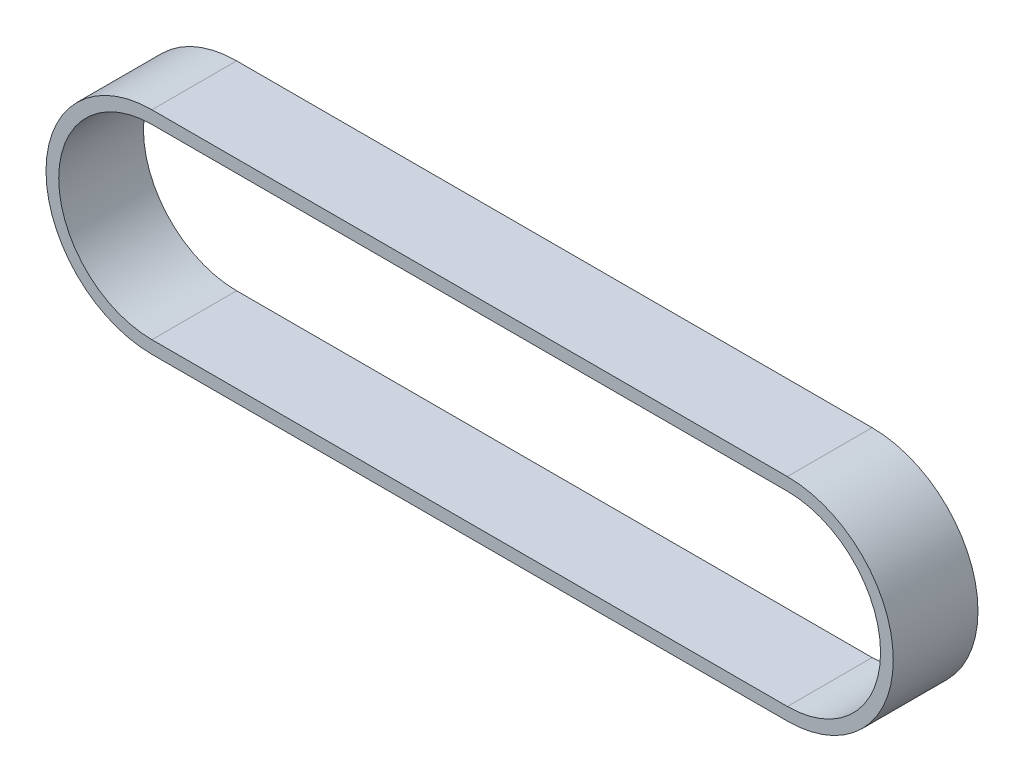
ISO-10303-21;
HEADER;
FILE_DESCRIPTION(('STEP AP214'),'2;1');
FILE_NAME('part.step','',(''),(''),'','','');
FILE_SCHEMA(('AUTOMOTIVE_DESIGN { 1 0 10303 214 1 1 1 1 }'));
ENDSEC;
DATA;
#1=APPLICATION_CONTEXT('core data for automotive mechanical design processes');
#2=APPLICATION_PROTOCOL_DEFINITION('international standard','automotive_design',2000,#1);
#3=PRODUCT_CONTEXT('',#1,'mechanical');
#4=PRODUCT('Part','Part','',(#3));
#5=PRODUCT_RELATED_PRODUCT_CATEGORY('part','',(#4));
#6=PRODUCT_DEFINITION_FORMATION('','',#4);
#7=PRODUCT_DEFINITION_CONTEXT('part definition',#1,'design');
#8=PRODUCT_DEFINITION('design','',#6,#7);
#9=PRODUCT_DEFINITION_SHAPE('','',#8);
#10=(LENGTH_UNIT() NAMED_UNIT(*) SI_UNIT(.MILLI.,.METRE.));
#11=(NAMED_UNIT(*) PLANE_ANGLE_UNIT() SI_UNIT($,.RADIAN.));
#12=(NAMED_UNIT(*) SI_UNIT($,.STERADIAN.) SOLID_ANGLE_UNIT());
#13=UNCERTAINTY_MEASURE_WITH_UNIT(LENGTH_MEASURE(1.E-05),#10,'distance_accuracy_value','');
#14=(GEOMETRIC_REPRESENTATION_CONTEXT(3) GLOBAL_UNCERTAINTY_ASSIGNED_CONTEXT((#13)) GLOBAL_UNIT_ASSIGNED_CONTEXT((#10,
#11,#12)) REPRESENTATION_CONTEXT('',''));
#15=CARTESIAN_POINT('',(0.,0.,0.));
#16=DIRECTION('',(0.,0.,1.));
#17=DIRECTION('',(1.,0.,0.));
#18=AXIS2_PLACEMENT_3D('',#15,#16,#17);
#19=CARTESIAN_POINT('',(5.24580379135386E-12,-9.09688990802238E-12,20.));
#20=DIRECTION('',(0.,0.,-1.));
#21=DIRECTION('',(-1.,0.,0.));
#22=AXIS2_PLACEMENT_3D('',#19,#20,#21);
#23=PLANE('',#22);
#24=CARTESIAN_POINT('',(5.24580379135386E-12,-9.09688990802238E-12,20.));
#25=DIRECTION('',(0.,0.,-1.));
#26=DIRECTION('',(-1.,0.,0.));
#27=AXIS2_PLACEMENT_3D('',#24,#25,#26);
#28=CIRCLE('',#27,50.);
#29=CARTESIAN_POINT('',(-0.0070480078109051,49.9999995032468,20.));
#30=VERTEX_POINT('',#29);
#31=CARTESIAN_POINT('',(0.00704800782141968,-49.999999503265,20.));
#32=VERTEX_POINT('',#31);
#33=EDGE_CURVE('E160',#30,#32,#28,.F.);
#34=ORIENTED_EDGE('',*,*,#33,.T.);
#35=DIRECTION('',(0.999999990065117,0.000140960156323018,0.));
#36=VECTOR('',#35,1.);
#37=CARTESIAN_POINT('',(0.00704800782139671,-49.999999503265,20.));
#38=LINE('',#37,#36);
#39=CARTESIAN_POINT('',(300.00704502735,-49.9577114563681,20.));
#40=VERTEX_POINT('',#39);
#41=EDGE_CURVE('E163',#32,#40,#38,.T.);
#42=ORIENTED_EDGE('',*,*,#41,.T.);
#43=CARTESIAN_POINT('',(299.999997019533,0.0422880468878076,20.));
#44=DIRECTION('',(0.,0.,-1.));
#45=DIRECTION('',(-1.,0.,0.));
#46=AXIS2_PLACEMENT_3D('',#43,#44,#45);
#47=CIRCLE('',#46,50.);
#48=CARTESIAN_POINT('',(299.992949011717,50.0422875501437,20.));
#49=VERTEX_POINT('',#48);
#50=EDGE_CURVE('E166',#40,#49,#47,.F.);
#51=ORIENTED_EDGE('',*,*,#50,.T.);
#52=DIRECTION('',(-0.999999990065117,-0.000140960156323018,0.));
#53=VECTOR('',#52,1.);
#54=CARTESIAN_POINT('',(-0.0070480078109051,49.9999995032468,20.));
#55=LINE('',#54,#53);
#56=EDGE_CURVE('E168',#49,#30,#55,.T.);
#57=ORIENTED_EDGE('',*,*,#56,.T.);
#58=EDGE_LOOP('',(#34,#42,#51,#57));
#59=FACE_BOUND('',#58,.T.);
#60=CARTESIAN_POINT('',(5.24580379135386E-12,-9.09688990802238E-12,20.));
#61=DIRECTION('',(0.,0.,1.));
#62=DIRECTION('',(-1.,0.,0.));
#63=AXIS2_PLACEMENT_3D('',#60,#61,#62);
#64=CIRCLE('',#63,44.);
#65=CARTESIAN_POINT('',(-0.006202246872967,43.9999995628561,20.));
#66=VERTEX_POINT('',#65);
#67=CARTESIAN_POINT('',(0.0062022468834586,-43.9999995628743,20.));
#68=VERTEX_POINT('',#67);
#69=EDGE_CURVE('E124',#66,#68,#64,.T.);
#70=ORIENTED_EDGE('',*,*,#69,.F.);
#71=DIRECTION('',(-0.999999990065117,-0.000140960156323018,0.));
#72=VECTOR('',#71,1.);
#73=CARTESIAN_POINT('',(-0.006202246872967,43.9999995628561,20.));
#74=LINE('',#73,#72);
#75=CARTESIAN_POINT('',(299.993794772655,44.042287609753,20.));
#76=VERTEX_POINT('',#75);
#77=EDGE_CURVE('E146',#76,#66,#74,.T.);
#78=ORIENTED_EDGE('',*,*,#77,.F.);
#79=CARTESIAN_POINT('',(299.999997019533,0.0422880468878076,20.));
#80=DIRECTION('',(0.,0.,1.));
#81=DIRECTION('',(-1.,0.,0.));
#82=AXIS2_PLACEMENT_3D('',#79,#80,#81);
#83=CIRCLE('',#82,44.);
#84=CARTESIAN_POINT('',(300.006199266412,-43.9577115159774,20.));
#85=VERTEX_POINT('',#84);
#86=EDGE_CURVE('E144',#85,#76,#83,.T.);
#87=ORIENTED_EDGE('',*,*,#86,.F.);
#88=DIRECTION('',(0.999999990065117,0.000140960156323018,0.));
#89=VECTOR('',#88,1.);
#90=CARTESIAN_POINT('',(300.006199266412,-43.9577115159774,20.));
#91=LINE('',#90,#89);
#92=EDGE_CURVE('E132',#68,#85,#91,.T.);
#93=ORIENTED_EDGE('',*,*,#92,.F.);
#94=EDGE_LOOP('',(#70,#78,#87,#93));
#95=FACE_BOUND('',#94,.T.);
#96=ADVANCED_FACE('F59',(#59,#95),#23,.F.);
#97=CARTESIAN_POINT('',(5.24580379135386E-12,-9.09688990802238E-12,-20.));
#98=DIRECTION('',(0.,0.,-1.));
#99=DIRECTION('',(-1.,0.,0.));
#100=AXIS2_PLACEMENT_3D('',#97,#98,#99);
#101=PLANE('',#100);
#102=CARTESIAN_POINT('',(5.24580379135386E-12,-9.09688990802238E-12,-20.));
#103=DIRECTION('',(0.,0.,-1.));
#104=DIRECTION('',(-1.,0.,0.));
#105=AXIS2_PLACEMENT_3D('',#102,#103,#104);
#106=CIRCLE('',#105,50.);
#107=CARTESIAN_POINT('',(-0.0070480078109051,49.9999995032468,-20.));
#108=VERTEX_POINT('',#107);
#109=CARTESIAN_POINT('',(0.00704800782141968,-49.999999503265,-20.));
#110=VERTEX_POINT('',#109);
#111=EDGE_CURVE('E140',#108,#110,#106,.F.);
#112=ORIENTED_EDGE('',*,*,#111,.F.);
#113=DIRECTION('',(-0.999999990065117,-0.000140960156323018,0.));
#114=VECTOR('',#113,1.);
#115=CARTESIAN_POINT('',(-0.0070480078109051,49.9999995032468,-20.));
#116=LINE('',#115,#114);
#117=CARTESIAN_POINT('',(299.992949011717,50.0422875501437,-20.));
#118=VERTEX_POINT('',#117);
#119=EDGE_CURVE('E164',#118,#108,#116,.T.);
#120=ORIENTED_EDGE('',*,*,#119,.F.);
#121=CARTESIAN_POINT('',(299.999997019533,0.0422880468878076,-20.));
#122=DIRECTION('',(0.,0.,-1.));
#123=DIRECTION('',(-1.,0.,0.));
#124=AXIS2_PLACEMENT_3D('',#121,#122,#123);
#125=CIRCLE('',#124,50.);
#126=CARTESIAN_POINT('',(300.00704502735,-49.9577114563681,-20.));
#127=VERTEX_POINT('',#126);
#128=EDGE_CURVE('E175',#127,#118,#125,.F.);
#129=ORIENTED_EDGE('',*,*,#128,.F.);
#130=DIRECTION('',(0.999999990065117,0.000140960156323018,0.));
#131=VECTOR('',#130,1.);
#132=CARTESIAN_POINT('',(0.00704800782139671,-49.999999503265,-20.));
#133=LINE('',#132,#131);
#134=EDGE_CURVE('E173',#110,#127,#133,.T.);
#135=ORIENTED_EDGE('',*,*,#134,.F.);
#136=EDGE_LOOP('',(#112,#120,#129,#135));
#137=FACE_BOUND('',#136,.T.);
#138=DIRECTION('',(-0.999999990065117,-0.000140960156323018,0.));
#139=VECTOR('',#138,1.);
#140=CARTESIAN_POINT('',(-0.006202246872967,43.9999995628561,-20.));
#141=LINE('',#140,#139);
#142=CARTESIAN_POINT('',(299.993794772655,44.042287609753,-20.));
#143=VERTEX_POINT('',#142);
#144=CARTESIAN_POINT('',(-0.006202246872967,43.9999995628561,-20.));
#145=VERTEX_POINT('',#144);
#146=EDGE_CURVE('E133',#143,#145,#141,.T.);
#147=ORIENTED_EDGE('',*,*,#146,.T.);
#148=CARTESIAN_POINT('',(5.24580379135386E-12,-9.09688990802238E-12,-20.));
#149=DIRECTION('',(0.,0.,1.));
#150=DIRECTION('',(-1.,0.,0.));
#151=AXIS2_PLACEMENT_3D('',#148,#149,#150);
#152=CIRCLE('',#151,44.);
#153=CARTESIAN_POINT('',(0.0062022468834586,-43.9999995628743,-20.));
#154=VERTEX_POINT('',#153);
#155=EDGE_CURVE('E82',#145,#154,#152,.T.);
#156=ORIENTED_EDGE('',*,*,#155,.T.);
#157=DIRECTION('',(0.999999990065117,0.000140960156323018,0.));
#158=VECTOR('',#157,1.);
#159=CARTESIAN_POINT('',(300.006199266412,-43.9577115159774,-20.));
#160=LINE('',#159,#158);
#161=CARTESIAN_POINT('',(300.006199266412,-43.9577115159774,-20.));
#162=VERTEX_POINT('',#161);
#163=EDGE_CURVE('E139',#154,#162,#160,.T.);
#164=ORIENTED_EDGE('',*,*,#163,.T.);
#165=CARTESIAN_POINT('',(299.999997019533,0.0422880468878076,-20.));
#166=DIRECTION('',(0.,0.,1.));
#167=DIRECTION('',(-1.,0.,0.));
#168=AXIS2_PLACEMENT_3D('',#165,#166,#167);
#169=CIRCLE('',#168,44.);
#170=EDGE_CURVE('E152',#162,#143,#169,.T.);
#171=ORIENTED_EDGE('',*,*,#170,.T.);
#172=EDGE_LOOP('',(#147,#156,#164,#171));
#173=FACE_BOUND('',#172,.T.);
#174=ADVANCED_FACE('F193',(#137,#173),#101,.T.);
#175=CARTESIAN_POINT('',(5.24580379135386E-12,-9.09688990802238E-12,20.));
#176=DIRECTION('',(0.,0.,-1.));
#177=DIRECTION('',(-1.,0.,0.));
#178=AXIS2_PLACEMENT_3D('',#175,#176,#177);
#179=CYLINDRICAL_SURFACE('',#178,50.);
#180=ORIENTED_EDGE('',*,*,#111,.T.);
#181=DIRECTION('',(0.,0.,-1.));
#182=VECTOR('',#181,1.);
#183=CARTESIAN_POINT('',(0.00704800782141968,-49.999999503265,20.));
#184=LINE('',#183,#182);
#185=EDGE_CURVE('E12',#32,#110,#184,.T.);
#186=ORIENTED_EDGE('',*,*,#185,.F.);
#187=ORIENTED_EDGE('',*,*,#33,.F.);
#188=DIRECTION('',(0.,0.,-1.));
#189=VECTOR('',#188,1.);
#190=CARTESIAN_POINT('',(-0.0070480078109051,49.9999995032468,20.));
#191=LINE('',#190,#189);
#192=EDGE_CURVE('E170',#30,#108,#191,.T.);
#193=ORIENTED_EDGE('',*,*,#192,.T.);
#194=EDGE_LOOP('',(#180,#186,#187,#193));
#195=FACE_BOUND('',#194,.T.);
#196=ADVANCED_FACE('F61',(#195),#179,.T.);
#197=CARTESIAN_POINT('',(0.00704800782139671,-49.999999503265,20.));
#198=DIRECTION('',(-0.000140960156323018,0.999999990065117,0.));
#199=DIRECTION('',(-0.999999990065117,-0.000140960156323018,0.));
#200=AXIS2_PLACEMENT_3D('',#197,#198,#199);
#201=PLANE('',#200);
#202=ORIENTED_EDGE('',*,*,#134,.T.);
#203=DIRECTION('',(0.,0.,-1.));
#204=VECTOR('',#203,1.);
#205=CARTESIAN_POINT('',(300.00704502735,-49.9577114563681,20.));
#206=LINE('',#205,#204);
#207=EDGE_CURVE('E67',#40,#127,#206,.T.);
#208=ORIENTED_EDGE('',*,*,#207,.F.);
#209=ORIENTED_EDGE('',*,*,#41,.F.);
#210=ORIENTED_EDGE('',*,*,#185,.T.);
#211=EDGE_LOOP('',(#202,#208,#209,#210));
#212=FACE_BOUND('',#211,.T.);
#213=ADVANCED_FACE('F203',(#212),#201,.F.);
#214=CARTESIAN_POINT('',(299.999997019533,0.0422880468878076,20.));
#215=DIRECTION('',(0.,0.,-1.));
#216=DIRECTION('',(-1.,0.,0.));
#217=AXIS2_PLACEMENT_3D('',#214,#215,#216);
#218=CYLINDRICAL_SURFACE('',#217,50.);
#219=ORIENTED_EDGE('',*,*,#128,.T.);
#220=DIRECTION('',(0.,0.,-1.));
#221=VECTOR('',#220,1.);
#222=CARTESIAN_POINT('',(299.992949011717,50.0422875501437,20.));
#223=LINE('',#222,#221);
#224=EDGE_CURVE('E180',#49,#118,#223,.T.);
#225=ORIENTED_EDGE('',*,*,#224,.F.);
#226=ORIENTED_EDGE('',*,*,#50,.F.);
#227=ORIENTED_EDGE('',*,*,#207,.T.);
#228=EDGE_LOOP('',(#219,#225,#226,#227));
#229=FACE_BOUND('',#228,.T.);
#230=ADVANCED_FACE('F187',(#229),#218,.T.);
#231=CARTESIAN_POINT('',(-0.0070480078109051,49.9999995032468,20.));
#232=DIRECTION('',(0.000140960156323018,-0.999999990065117,0.));
#233=DIRECTION('',(0.999999990065117,0.000140960156323018,0.));
#234=AXIS2_PLACEMENT_3D('',#231,#232,#233);
#235=PLANE('',#234);
#236=ORIENTED_EDGE('',*,*,#119,.T.);
#237=ORIENTED_EDGE('',*,*,#192,.F.);
#238=ORIENTED_EDGE('',*,*,#56,.F.);
#239=ORIENTED_EDGE('',*,*,#224,.T.);
#240=EDGE_LOOP('',(#236,#237,#238,#239));
#241=FACE_BOUND('',#240,.T.);
#242=ADVANCED_FACE('F197',(#241),#235,.F.);
#243=CARTESIAN_POINT('',(5.24580379135386E-12,-9.09688990802238E-12,20.));
#244=DIRECTION('',(0.,0.,-1.));
#245=DIRECTION('',(-1.,0.,0.));
#246=AXIS2_PLACEMENT_3D('',#243,#244,#245);
#247=CYLINDRICAL_SURFACE('',#246,44.);
#248=ORIENTED_EDGE('',*,*,#155,.F.);
#249=DIRECTION('',(0.,0.,-1.));
#250=VECTOR('',#249,1.);
#251=CARTESIAN_POINT('',(-0.006202246872967,43.9999995628561,20.));
#252=LINE('',#251,#250);
#253=EDGE_CURVE('E128',#66,#145,#252,.T.);
#254=ORIENTED_EDGE('',*,*,#253,.F.);
#255=ORIENTED_EDGE('',*,*,#69,.T.);
#256=DIRECTION('',(0.,0.,-1.));
#257=VECTOR('',#256,1.);
#258=CARTESIAN_POINT('',(0.0062022468834586,-43.9999995628743,20.));
#259=LINE('',#258,#257);
#260=EDGE_CURVE('E127',#68,#154,#259,.T.);
#261=ORIENTED_EDGE('',*,*,#260,.T.);
#262=EDGE_LOOP('',(#248,#254,#255,#261));
#263=FACE_BOUND('',#262,.T.);
#264=ADVANCED_FACE('F126',(#263),#247,.F.);
#265=CARTESIAN_POINT('',(300.006199266412,-43.9577115159774,20.));
#266=DIRECTION('',(-0.000140960156323018,0.999999990065117,0.));
#267=DIRECTION('',(-0.999999990065117,-0.000140960156323018,0.));
#268=AXIS2_PLACEMENT_3D('',#265,#266,#267);
#269=PLANE('',#268);
#270=ORIENTED_EDGE('',*,*,#163,.F.);
#271=ORIENTED_EDGE('',*,*,#260,.F.);
#272=ORIENTED_EDGE('',*,*,#92,.T.);
#273=DIRECTION('',(0.,0.,-1.));
#274=VECTOR('',#273,1.);
#275=CARTESIAN_POINT('',(300.006199266412,-43.9577115159774,20.));
#276=LINE('',#275,#274);
#277=EDGE_CURVE('E141',#85,#162,#276,.T.);
#278=ORIENTED_EDGE('',*,*,#277,.T.);
#279=EDGE_LOOP('',(#270,#271,#272,#278));
#280=FACE_BOUND('',#279,.T.);
#281=ADVANCED_FACE('F136',(#280),#269,.T.);
#282=CARTESIAN_POINT('',(299.999997019533,0.0422880468878076,20.));
#283=DIRECTION('',(0.,0.,-1.));
#284=DIRECTION('',(-1.,0.,0.));
#285=AXIS2_PLACEMENT_3D('',#282,#283,#284);
#286=CYLINDRICAL_SURFACE('',#285,44.);
#287=ORIENTED_EDGE('',*,*,#170,.F.);
#288=ORIENTED_EDGE('',*,*,#277,.F.);
#289=ORIENTED_EDGE('',*,*,#86,.T.);
#290=DIRECTION('',(0.,0.,-1.));
#291=VECTOR('',#290,1.);
#292=CARTESIAN_POINT('',(299.993794772655,44.042287609753,20.));
#293=LINE('',#292,#291);
#294=EDGE_CURVE('E74',#76,#143,#293,.T.);
#295=ORIENTED_EDGE('',*,*,#294,.T.);
#296=EDGE_LOOP('',(#287,#288,#289,#295));
#297=FACE_BOUND('',#296,.T.);
#298=ADVANCED_FACE('F226',(#297),#286,.F.);
#299=CARTESIAN_POINT('',(-0.006202246872967,43.9999995628561,20.));
#300=DIRECTION('',(0.000140960156323018,-0.999999990065117,0.));
#301=DIRECTION('',(0.999999990065117,0.000140960156323018,0.));
#302=AXIS2_PLACEMENT_3D('',#299,#300,#301);
#303=PLANE('',#302);
#304=ORIENTED_EDGE('',*,*,#146,.F.);
#305=ORIENTED_EDGE('',*,*,#294,.F.);
#306=ORIENTED_EDGE('',*,*,#77,.T.);
#307=ORIENTED_EDGE('',*,*,#253,.T.);
#308=EDGE_LOOP('',(#304,#305,#306,#307));
#309=FACE_BOUND('',#308,.T.);
#310=ADVANCED_FACE('F230',(#309),#303,.T.);
#311=CLOSED_SHELL('',(#96,#174,#196,#213,#230,#242,#264,#281,#298,#310));
#312=MANIFOLD_SOLID_BREP('B2',#311);
#313=ADVANCED_BREP_SHAPE_REPRESENTATION('',(#18,#312),#14);
#314=SHAPE_DEFINITION_REPRESENTATION(#9,#313);
ENDSEC;
END-ISO-10303-21;
